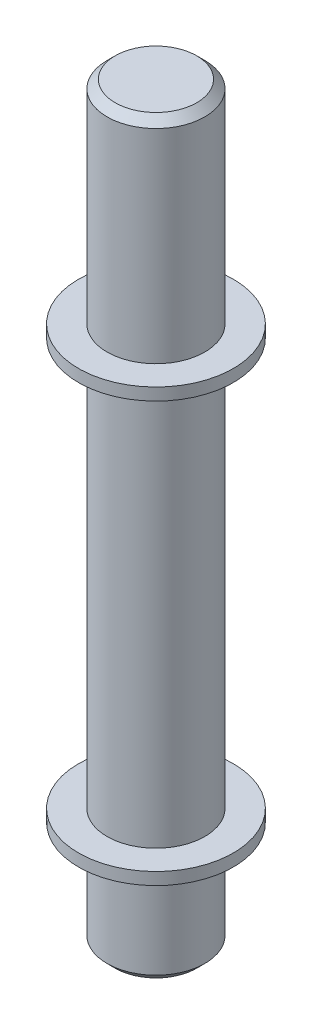
ISO-10303-21;
HEADER;
FILE_DESCRIPTION(('STEP AP214'),'2;1');
FILE_NAME('part.step','',(''),(''),'','','');
FILE_SCHEMA(('AUTOMOTIVE_DESIGN { 1 0 10303 214 1 1 1 1 }'));
ENDSEC;
DATA;
#1=APPLICATION_CONTEXT('core data for automotive mechanical design processes');
#2=APPLICATION_PROTOCOL_DEFINITION('international standard','automotive_design',2000,#1);
#3=PRODUCT_CONTEXT('',#1,'mechanical');
#4=PRODUCT('Part','Part','',(#3));
#5=PRODUCT_RELATED_PRODUCT_CATEGORY('part','',(#4));
#6=PRODUCT_DEFINITION_FORMATION('','',#4);
#7=PRODUCT_DEFINITION_CONTEXT('part definition',#1,'design');
#8=PRODUCT_DEFINITION('design','',#6,#7);
#9=PRODUCT_DEFINITION_SHAPE('','',#8);
#10=(LENGTH_UNIT() NAMED_UNIT(*) SI_UNIT(.MILLI.,.METRE.));
#11=(NAMED_UNIT(*) PLANE_ANGLE_UNIT() SI_UNIT($,.RADIAN.));
#12=(NAMED_UNIT(*) SI_UNIT($,.STERADIAN.) SOLID_ANGLE_UNIT());
#13=UNCERTAINTY_MEASURE_WITH_UNIT(LENGTH_MEASURE(1.E-05),#10,'distance_accuracy_value','');
#14=(GEOMETRIC_REPRESENTATION_CONTEXT(3) GLOBAL_UNCERTAINTY_ASSIGNED_CONTEXT((#13)) GLOBAL_UNIT_ASSIGNED_CONTEXT((#10,
#11,#12)) REPRESENTATION_CONTEXT('',''));
#15=CARTESIAN_POINT('',(0.,0.,0.));
#16=DIRECTION('',(0.,0.,1.));
#17=DIRECTION('',(1.,0.,0.));
#18=AXIS2_PLACEMENT_3D('',#15,#16,#17);
#19=CARTESIAN_POINT('',(0.,0.,0.));
#20=DIRECTION('',(0.,1.,0.));
#21=DIRECTION('',(-1.,0.,0.));
#22=AXIS2_PLACEMENT_3D('',#19,#20,#21);
#23=PLANE('',#22);
#24=CARTESIAN_POINT('',(0.,0.,0.));
#25=DIRECTION('',(0.,1.,0.));
#26=DIRECTION('',(-1.,0.,0.));
#27=AXIS2_PLACEMENT_3D('',#24,#25,#26);
#28=CIRCLE('',#27,10.);
#29=CARTESIAN_POINT('',(-10.,0.,0.));
#30=VERTEX_POINT('',#29);
#31=EDGE_CURVE('E51',#30,#30,#28,.F.);
#32=ORIENTED_EDGE('',*,*,#31,.T.);
#33=EDGE_LOOP('',(#32));
#34=FACE_BOUND('',#33,.T.);
#35=ADVANCED_FACE('F39',(#34),#23,.F.);
#36=CARTESIAN_POINT('',(0.,184.,0.));
#37=DIRECTION('',(0.,1.,0.));
#38=DIRECTION('',(-1.,0.,0.));
#39=AXIS2_PLACEMENT_3D('',#36,#37,#38);
#40=CYLINDRICAL_SURFACE('',#39,12.);
#41=CARTESIAN_POINT('',(0.,1.99999999999997,0.));
#42=DIRECTION('',(0.,1.,0.));
#43=DIRECTION('',(-1.,0.,0.));
#44=AXIS2_PLACEMENT_3D('',#41,#42,#43);
#45=CIRCLE('',#44,12.);
#46=CARTESIAN_POINT('',(-12.,1.99999999999997,0.));
#47=VERTEX_POINT('',#46);
#48=EDGE_CURVE('E55',#47,#47,#45,.T.);
#49=ORIENTED_EDGE('',*,*,#48,.T.);
#50=EDGE_LOOP('',(#49));
#51=FACE_BOUND('',#50,.T.);
#52=CARTESIAN_POINT('',(0.,26.,0.));
#53=DIRECTION('',(0.,1.,0.));
#54=DIRECTION('',(-1.,0.,0.));
#55=AXIS2_PLACEMENT_3D('',#52,#53,#54);
#56=CIRCLE('',#55,12.);
#57=CARTESIAN_POINT('',(-12.,26.,0.));
#58=VERTEX_POINT('',#57);
#59=EDGE_CURVE('E60',#58,#58,#56,.T.);
#60=ORIENTED_EDGE('',*,*,#59,.F.);
#61=EDGE_LOOP('',(#60));
#62=FACE_BOUND('',#61,.T.);
#63=ADVANCED_FACE('F126',(#51,#62),#40,.T.);
#64=CARTESIAN_POINT('',(12.,26.,0.));
#65=DIRECTION('',(0.,1.,0.));
#66=DIRECTION('',(-1.,0.,0.));
#67=AXIS2_PLACEMENT_3D('',#64,#65,#66);
#68=PLANE('',#67);
#69=CARTESIAN_POINT('',(0.,26.,0.));
#70=DIRECTION('',(0.,1.,0.));
#71=DIRECTION('',(-1.,0.,0.));
#72=AXIS2_PLACEMENT_3D('',#69,#70,#71);
#73=CIRCLE('',#72,19.);
#74=CARTESIAN_POINT('',(-19.,26.,0.));
#75=VERTEX_POINT('',#74);
#76=EDGE_CURVE('E63',#75,#75,#73,.T.);
#77=ORIENTED_EDGE('',*,*,#76,.F.);
#78=EDGE_LOOP('',(#77));
#79=FACE_BOUND('',#78,.T.);
#80=ORIENTED_EDGE('',*,*,#59,.T.);
#81=EDGE_LOOP('',(#80));
#82=FACE_BOUND('',#81,.T.);
#83=ADVANCED_FACE('F120',(#79,#82),#68,.F.);
#84=CARTESIAN_POINT('',(0.,184.,0.));
#85=DIRECTION('',(0.,1.,0.));
#86=DIRECTION('',(-1.,0.,0.));
#87=AXIS2_PLACEMENT_3D('',#84,#85,#86);
#88=CYLINDRICAL_SURFACE('',#87,19.);
#89=CARTESIAN_POINT('',(0.,29.,0.));
#90=DIRECTION('',(0.,1.,0.));
#91=DIRECTION('',(-1.,0.,0.));
#92=AXIS2_PLACEMENT_3D('',#89,#90,#91);
#93=CIRCLE('',#92,19.);
#94=CARTESIAN_POINT('',(-19.,29.,0.));
#95=VERTEX_POINT('',#94);
#96=EDGE_CURVE('E66',#95,#95,#93,.T.);
#97=ORIENTED_EDGE('',*,*,#96,.F.);
#98=EDGE_LOOP('',(#97));
#99=FACE_BOUND('',#98,.T.);
#100=ORIENTED_EDGE('',*,*,#76,.T.);
#101=EDGE_LOOP('',(#100));
#102=FACE_BOUND('',#101,.T.);
#103=ADVANCED_FACE('F114',(#99,#102),#88,.T.);
#104=CARTESIAN_POINT('',(19.,29.,0.));
#105=DIRECTION('',(0.,-1.,0.));
#106=DIRECTION('',(1.,0.,0.));
#107=AXIS2_PLACEMENT_3D('',#104,#105,#106);
#108=PLANE('',#107);
#109=CARTESIAN_POINT('',(0.,29.,0.));
#110=DIRECTION('',(0.,1.,0.));
#111=DIRECTION('',(-1.,0.,0.));
#112=AXIS2_PLACEMENT_3D('',#109,#110,#111);
#113=CIRCLE('',#112,12.);
#114=CARTESIAN_POINT('',(-12.,29.,0.));
#115=VERTEX_POINT('',#114);
#116=EDGE_CURVE('E69',#115,#115,#113,.T.);
#117=ORIENTED_EDGE('',*,*,#116,.F.);
#118=EDGE_LOOP('',(#117));
#119=FACE_BOUND('',#118,.T.);
#120=ORIENTED_EDGE('',*,*,#96,.T.);
#121=EDGE_LOOP('',(#120));
#122=FACE_BOUND('',#121,.T.);
#123=ADVANCED_FACE('F108',(#119,#122),#108,.F.);
#124=CARTESIAN_POINT('',(0.,184.,0.));
#125=DIRECTION('',(0.,1.,0.));
#126=DIRECTION('',(-1.,0.,0.));
#127=AXIS2_PLACEMENT_3D('',#124,#125,#126);
#128=CYLINDRICAL_SURFACE('',#127,12.);
#129=CARTESIAN_POINT('',(0.,129.,0.));
#130=DIRECTION('',(0.,1.,0.));
#131=DIRECTION('',(-1.,0.,0.));
#132=AXIS2_PLACEMENT_3D('',#129,#130,#131);
#133=CIRCLE('',#132,12.);
#134=CARTESIAN_POINT('',(-12.,129.,0.));
#135=VERTEX_POINT('',#134);
#136=EDGE_CURVE('E72',#135,#135,#133,.T.);
#137=ORIENTED_EDGE('',*,*,#136,.F.);
#138=EDGE_LOOP('',(#137));
#139=FACE_BOUND('',#138,.T.);
#140=ORIENTED_EDGE('',*,*,#116,.T.);
#141=EDGE_LOOP('',(#140));
#142=FACE_BOUND('',#141,.T.);
#143=ADVANCED_FACE('F102',(#139,#142),#128,.T.);
#144=CARTESIAN_POINT('',(12.,129.,0.));
#145=DIRECTION('',(0.,1.,0.));
#146=DIRECTION('',(-1.,0.,0.));
#147=AXIS2_PLACEMENT_3D('',#144,#145,#146);
#148=PLANE('',#147);
#149=CARTESIAN_POINT('',(0.,129.,0.));
#150=DIRECTION('',(0.,1.,0.));
#151=DIRECTION('',(-1.,0.,0.));
#152=AXIS2_PLACEMENT_3D('',#149,#150,#151);
#153=CIRCLE('',#152,19.);
#154=CARTESIAN_POINT('',(-19.,129.,0.));
#155=VERTEX_POINT('',#154);
#156=EDGE_CURVE('E75',#155,#155,#153,.T.);
#157=ORIENTED_EDGE('',*,*,#156,.F.);
#158=EDGE_LOOP('',(#157));
#159=FACE_BOUND('',#158,.T.);
#160=ORIENTED_EDGE('',*,*,#136,.T.);
#161=EDGE_LOOP('',(#160));
#162=FACE_BOUND('',#161,.T.);
#163=ADVANCED_FACE('F96',(#159,#162),#148,.F.);
#164=CARTESIAN_POINT('',(0.,184.,0.));
#165=DIRECTION('',(0.,1.,0.));
#166=DIRECTION('',(-1.,0.,0.));
#167=AXIS2_PLACEMENT_3D('',#164,#165,#166);
#168=CYLINDRICAL_SURFACE('',#167,19.);
#169=CARTESIAN_POINT('',(0.,132.,0.));
#170=DIRECTION('',(0.,1.,0.));
#171=DIRECTION('',(-1.,0.,0.));
#172=AXIS2_PLACEMENT_3D('',#169,#170,#171);
#173=CIRCLE('',#172,19.);
#174=CARTESIAN_POINT('',(-19.,132.,0.));
#175=VERTEX_POINT('',#174);
#176=EDGE_CURVE('E78',#175,#175,#173,.T.);
#177=ORIENTED_EDGE('',*,*,#176,.F.);
#178=EDGE_LOOP('',(#177));
#179=FACE_BOUND('',#178,.T.);
#180=ORIENTED_EDGE('',*,*,#156,.T.);
#181=EDGE_LOOP('',(#180));
#182=FACE_BOUND('',#181,.T.);
#183=ADVANCED_FACE('F90',(#179,#182),#168,.T.);
#184=CARTESIAN_POINT('',(19.,132.,0.));
#185=DIRECTION('',(0.,-1.,0.));
#186=DIRECTION('',(1.,0.,0.));
#187=AXIS2_PLACEMENT_3D('',#184,#185,#186);
#188=PLANE('',#187);
#189=CARTESIAN_POINT('',(0.,132.,0.));
#190=DIRECTION('',(0.,1.,0.));
#191=DIRECTION('',(-1.,0.,0.));
#192=AXIS2_PLACEMENT_3D('',#189,#190,#191);
#193=CIRCLE('',#192,12.);
#194=CARTESIAN_POINT('',(-12.,132.,0.));
#195=VERTEX_POINT('',#194);
#196=EDGE_CURVE('E81',#195,#195,#193,.T.);
#197=ORIENTED_EDGE('',*,*,#196,.F.);
#198=EDGE_LOOP('',(#197));
#199=FACE_BOUND('',#198,.T.);
#200=ORIENTED_EDGE('',*,*,#176,.T.);
#201=EDGE_LOOP('',(#200));
#202=FACE_BOUND('',#201,.T.);
#203=ADVANCED_FACE('F87',(#199,#202),#188,.F.);
#204=CARTESIAN_POINT('',(0.,184.,0.));
#205=DIRECTION('',(0.,1.,0.));
#206=DIRECTION('',(-1.,0.,0.));
#207=AXIS2_PLACEMENT_3D('',#204,#205,#206);
#208=CYLINDRICAL_SURFACE('',#207,12.);
#209=CARTESIAN_POINT('',(0.,182.,0.));
#210=DIRECTION('',(0.,-1.,0.));
#211=DIRECTION('',(1.,0.,0.));
#212=AXIS2_PLACEMENT_3D('',#209,#210,#211);
#213=CIRCLE('',#212,12.);
#214=CARTESIAN_POINT('',(12.,182.,0.));
#215=VERTEX_POINT('',#214);
#216=EDGE_CURVE('E10',#215,#215,#213,.T.);
#217=ORIENTED_EDGE('',*,*,#216,.T.);
#218=EDGE_LOOP('',(#217));
#219=FACE_BOUND('',#218,.T.);
#220=ORIENTED_EDGE('',*,*,#196,.T.);
#221=EDGE_LOOP('',(#220));
#222=FACE_BOUND('',#221,.T.);
#223=ADVANCED_FACE('F85',(#219,#222),#208,.T.);
#224=CARTESIAN_POINT('',(12.,184.,0.));
#225=DIRECTION('',(0.,-1.,0.));
#226=DIRECTION('',(1.,0.,0.));
#227=AXIS2_PLACEMENT_3D('',#224,#225,#226);
#228=PLANE('',#227);
#229=CARTESIAN_POINT('',(0.,184.,0.));
#230=DIRECTION('',(0.,-1.,0.));
#231=DIRECTION('',(1.,0.,0.));
#232=AXIS2_PLACEMENT_3D('',#229,#230,#231);
#233=CIRCLE('',#232,9.99999999999998);
#234=CARTESIAN_POINT('',(9.99999999999998,184.,0.));
#235=VERTEX_POINT('',#234);
#236=EDGE_CURVE('E47',#235,#235,#233,.F.);
#237=ORIENTED_EDGE('',*,*,#236,.T.);
#238=EDGE_LOOP('',(#237));
#239=FACE_BOUND('',#238,.T.);
#240=ADVANCED_FACE('F143',(#239),#228,.F.);
#241=CARTESIAN_POINT('',(0.,1.99999999999997,0.));
#242=DIRECTION('',(0.,1.,0.));
#243=DIRECTION('',(-1.,0.,0.));
#244=AXIS2_PLACEMENT_3D('',#241,#242,#243);
#245=CONICAL_SURFACE('',#244,12.,0.785398163397453);
#246=ORIENTED_EDGE('',*,*,#31,.F.);
#247=EDGE_LOOP('',(#246));
#248=FACE_BOUND('',#247,.T.);
#249=ORIENTED_EDGE('',*,*,#48,.F.);
#250=EDGE_LOOP('',(#249));
#251=FACE_BOUND('',#250,.T.);
#252=ADVANCED_FACE('F139',(#248,#251),#245,.T.);
#253=CARTESIAN_POINT('',(0.,184.,0.));
#254=DIRECTION('',(0.,-1.,0.));
#255=DIRECTION('',(1.,0.,0.));
#256=AXIS2_PLACEMENT_3D('',#253,#254,#255);
#257=CONICAL_SURFACE('',#256,9.99999999999998,0.785398163397454);
#258=ORIENTED_EDGE('',*,*,#216,.F.);
#259=EDGE_LOOP('',(#258));
#260=FACE_BOUND('',#259,.T.);
#261=ORIENTED_EDGE('',*,*,#236,.F.);
#262=EDGE_LOOP('',(#261));
#263=FACE_BOUND('',#262,.T.);
#264=ADVANCED_FACE('F42',(#260,#263),#257,.T.);
#265=CLOSED_SHELL('',(#35,#63,#83,#103,#123,#143,#163,#183,#203,#223,#240,#252,#264));
#266=MANIFOLD_SOLID_BREP('B2',#265);
#267=ADVANCED_BREP_SHAPE_REPRESENTATION('',(#18,#266),#14);
#268=SHAPE_DEFINITION_REPRESENTATION(#9,#267);
ENDSEC;
END-ISO-10303-21;
